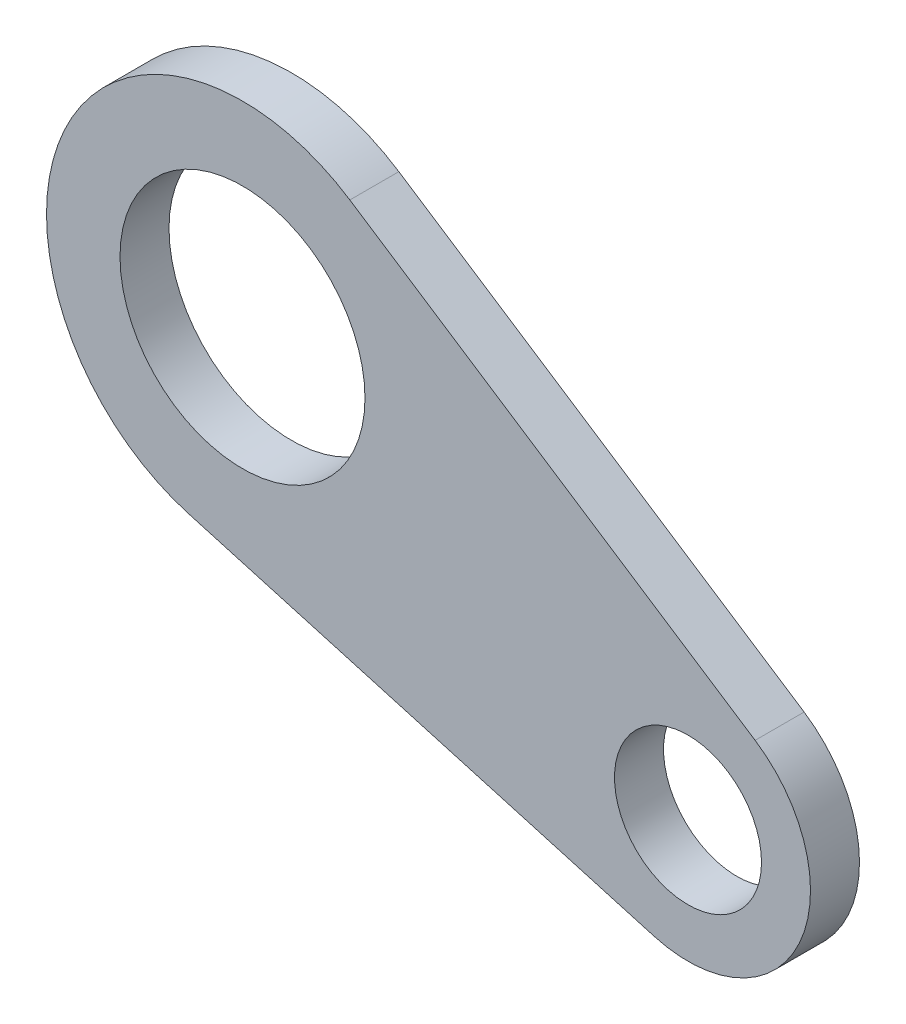
ISO-10303-21;
HEADER;
FILE_DESCRIPTION(('STEP AP214'),'2;1');
FILE_NAME('part.step','',(''),(''),'','','');
FILE_SCHEMA(('AUTOMOTIVE_DESIGN { 1 0 10303 214 1 1 1 1 }'));
ENDSEC;
DATA;
#1=APPLICATION_CONTEXT('core data for automotive mechanical design processes');
#2=APPLICATION_PROTOCOL_DEFINITION('international standard','automotive_design',2000,#1);
#3=PRODUCT_CONTEXT('',#1,'mechanical');
#4=PRODUCT('Part','Part','',(#3));
#5=PRODUCT_RELATED_PRODUCT_CATEGORY('part','',(#4));
#6=PRODUCT_DEFINITION_FORMATION('','',#4);
#7=PRODUCT_DEFINITION_CONTEXT('part definition',#1,'design');
#8=PRODUCT_DEFINITION('design','',#6,#7);
#9=PRODUCT_DEFINITION_SHAPE('','',#8);
#10=(LENGTH_UNIT() NAMED_UNIT(*) SI_UNIT(.MILLI.,.METRE.));
#11=(NAMED_UNIT(*) PLANE_ANGLE_UNIT() SI_UNIT($,.RADIAN.));
#12=(NAMED_UNIT(*) SI_UNIT($,.STERADIAN.) SOLID_ANGLE_UNIT());
#13=UNCERTAINTY_MEASURE_WITH_UNIT(LENGTH_MEASURE(1.E-05),#10,'distance_accuracy_value','');
#14=(GEOMETRIC_REPRESENTATION_CONTEXT(3) GLOBAL_UNCERTAINTY_ASSIGNED_CONTEXT((#13)) GLOBAL_UNIT_ASSIGNED_CONTEXT((#10,
#11,#12)) REPRESENTATION_CONTEXT('',''));
#15=CARTESIAN_POINT('',(0.,0.,0.));
#16=DIRECTION('',(0.,0.,1.));
#17=DIRECTION('',(1.,0.,0.));
#18=AXIS2_PLACEMENT_3D('',#15,#16,#17);
#19=CARTESIAN_POINT('',(-104.570506238801,47.8540408425545,1.));
#20=DIRECTION('',(0.,0.,-1.));
#21=DIRECTION('',(-1.,0.,0.));
#22=AXIS2_PLACEMENT_3D('',#19,#20,#21);
#23=CYLINDRICAL_SURFACE('',#22,2.5);
#24=CARTESIAN_POINT('',(-104.570506238801,47.8540408425545,0.));
#25=DIRECTION('',(0.,0.,1.));
#26=DIRECTION('',(1.,0.,0.));
#27=AXIS2_PLACEMENT_3D('',#24,#25,#26);
#28=CIRCLE('',#27,2.5);
#29=CARTESIAN_POINT('',(-103.200980238787,49.9455471263809,0.));
#30=VERTEX_POINT('',#29);
#31=CARTESIAN_POINT('',(-105.258050676388,45.4504429880159,0.));
#32=VERTEX_POINT('',#31);
#33=EDGE_CURVE('E118',#30,#32,#28,.F.);
#34=ORIENTED_EDGE('',*,*,#33,.F.);
#35=DIRECTION('',(0.,0.,-1.));
#36=VECTOR('',#35,1.);
#37=CARTESIAN_POINT('',(-103.200980238787,49.9455471263809,1.));
#38=LINE('',#37,#36);
#39=CARTESIAN_POINT('',(-103.200980238787,49.9455471263809,1.));
#40=VERTEX_POINT('',#39);
#41=EDGE_CURVE('E11',#40,#30,#38,.T.);
#42=ORIENTED_EDGE('',*,*,#41,.F.);
#43=CARTESIAN_POINT('',(-104.570506238801,47.8540408425545,1.));
#44=DIRECTION('',(0.,0.,1.));
#45=DIRECTION('',(1.,0.,0.));
#46=AXIS2_PLACEMENT_3D('',#43,#44,#45);
#47=CIRCLE('',#46,2.5);
#48=CARTESIAN_POINT('',(-105.258050676388,45.4504429880159,1.));
#49=VERTEX_POINT('',#48);
#50=EDGE_CURVE('E99',#40,#49,#47,.F.);
#51=ORIENTED_EDGE('',*,*,#50,.T.);
#52=DIRECTION('',(0.,0.,-1.));
#53=VECTOR('',#52,1.);
#54=CARTESIAN_POINT('',(-105.258050676388,45.4504429880159,1.));
#55=LINE('',#54,#53);
#56=EDGE_CURVE('E58',#49,#32,#55,.T.);
#57=ORIENTED_EDGE('',*,*,#56,.T.);
#58=EDGE_LOOP('',(#34,#42,#51,#57));
#59=FACE_BOUND('',#58,.T.);
#60=ADVANCED_FACE('F41',(#59),#23,.T.);
#61=CARTESIAN_POINT('',(-8.08020340008388,-12.3398870745755,1.));
#62=DIRECTION('',(0.547810400005682,0.836602513530538,0.));
#63=DIRECTION('',(-0.836602513530538,0.547810400005682,0.));
#64=AXIS2_PLACEMENT_3D('',#61,#62,#63);
#65=PLANE('',#64);
#66=DIRECTION('',(0.836602513530538,-0.547810400005682,0.));
#67=VECTOR('',#66,1.);
#68=CARTESIAN_POINT('',(-8.08020340008388,-12.3398870745755,0.));
#69=LINE('',#68,#67);
#70=CARTESIAN_POINT('',(-111.472352137804,55.3616718395075,0.));
#71=VERTEX_POINT('',#70);
#72=EDGE_CURVE('E88',#71,#30,#69,.T.);
#73=ORIENTED_EDGE('',*,*,#72,.F.);
#74=DIRECTION('',(0.,0.,-1.));
#75=VECTOR('',#74,1.);
#76=CARTESIAN_POINT('',(-111.472352137804,55.3616718395075,1.));
#77=LINE('',#76,#75);
#78=CARTESIAN_POINT('',(-111.472352137804,55.3616718395075,1.));
#79=VERTEX_POINT('',#78);
#80=EDGE_CURVE('E50',#79,#71,#77,.T.);
#81=ORIENTED_EDGE('',*,*,#80,.F.);
#82=DIRECTION('',(0.836602513530538,-0.547810400005682,0.));
#83=VECTOR('',#82,1.);
#84=CARTESIAN_POINT('',(-8.08020340008388,-12.3398870745755,1.));
#85=LINE('',#84,#83);
#86=EDGE_CURVE('E86',#79,#40,#85,.T.);
#87=ORIENTED_EDGE('',*,*,#86,.T.);
#88=ORIENTED_EDGE('',*,*,#41,.T.);
#89=EDGE_LOOP('',(#73,#81,#87,#88));
#90=FACE_BOUND('',#89,.T.);
#91=ADVANCED_FACE('F85',(#90),#65,.T.);
#92=CARTESIAN_POINT('',(-113.663593737827,52.0152617853854,1.));
#93=DIRECTION('',(0.,0.,-1.));
#94=DIRECTION('',(-1.,0.,0.));
#95=AXIS2_PLACEMENT_3D('',#92,#93,#94);
#96=CYLINDRICAL_SURFACE('',#95,4.00000000000001);
#97=CARTESIAN_POINT('',(-113.663593737827,52.0152617853854,0.));
#98=DIRECTION('',(0.,0.,1.));
#99=DIRECTION('',(1.,0.,0.));
#100=AXIS2_PLACEMENT_3D('',#97,#98,#99);
#101=CIRCLE('',#100,4.00000000000001);
#102=CARTESIAN_POINT('',(-114.763664837967,48.1695052181235,0.));
#103=VERTEX_POINT('',#102);
#104=EDGE_CURVE('E123',#103,#71,#101,.F.);
#105=ORIENTED_EDGE('',*,*,#104,.F.);
#106=DIRECTION('',(0.,0.,-1.));
#107=VECTOR('',#106,1.);
#108=CARTESIAN_POINT('',(-114.763664837967,48.1695052181235,1.));
#109=LINE('',#108,#107);
#110=CARTESIAN_POINT('',(-114.763664837967,48.1695052181235,1.));
#111=VERTEX_POINT('',#110);
#112=EDGE_CURVE('E71',#111,#103,#109,.T.);
#113=ORIENTED_EDGE('',*,*,#112,.F.);
#114=CARTESIAN_POINT('',(-113.663593737827,52.0152617853854,1.));
#115=DIRECTION('',(0.,0.,1.));
#116=DIRECTION('',(1.,0.,0.));
#117=AXIS2_PLACEMENT_3D('',#114,#115,#116);
#118=CIRCLE('',#117,4.00000000000001);
#119=EDGE_CURVE('E98',#111,#79,#118,.F.);
#120=ORIENTED_EDGE('',*,*,#119,.T.);
#121=ORIENTED_EDGE('',*,*,#80,.T.);
#122=EDGE_LOOP('',(#105,#113,#120,#121));
#123=FACE_BOUND('',#122,.T.);
#124=ADVANCED_FACE('F102',(#123),#96,.T.);
#125=CARTESIAN_POINT('',(-113.663593737827,52.0152617853854,1.));
#126=DIRECTION('',(0.,0.,-1.));
#127=DIRECTION('',(-1.,0.,0.));
#128=AXIS2_PLACEMENT_3D('',#125,#126,#127);
#129=CYLINDRICAL_SURFACE('',#128,2.5);
#130=CARTESIAN_POINT('',(-113.663593737827,52.0152617853854,1.));
#131=DIRECTION('',(0.,0.,1.));
#132=DIRECTION('',(1.,0.,0.));
#133=AXIS2_PLACEMENT_3D('',#130,#131,#132);
#134=CIRCLE('',#133,2.5);
#135=CARTESIAN_POINT('',(-111.163593737827,52.0152617853854,1.));
#136=VERTEX_POINT('',#135);
#137=EDGE_CURVE('E107',#136,#136,#134,.T.);
#138=ORIENTED_EDGE('',*,*,#137,.T.);
#139=EDGE_LOOP('',(#138));
#140=FACE_BOUND('',#139,.T.);
#141=CARTESIAN_POINT('',(-113.663593737827,52.0152617853854,0.));
#142=DIRECTION('',(0.,0.,1.));
#143=DIRECTION('',(1.,0.,0.));
#144=AXIS2_PLACEMENT_3D('',#141,#142,#143);
#145=CIRCLE('',#144,2.5);
#146=CARTESIAN_POINT('',(-111.163593737827,52.0152617853854,0.));
#147=VERTEX_POINT('',#146);
#148=EDGE_CURVE('E130',#147,#147,#145,.T.);
#149=ORIENTED_EDGE('',*,*,#148,.F.);
#150=EDGE_LOOP('',(#149));
#151=FACE_BOUND('',#150,.T.);
#152=ADVANCED_FACE('F147',(#140,#151),#129,.F.);
#153=CARTESIAN_POINT('',(4.05651218176472,14.1812273417781,1.));
#154=DIRECTION('',(-0.275017775034896,-0.961439141815464,0.));
#155=DIRECTION('',(0.961439141815464,-0.275017775034896,0.));
#156=AXIS2_PLACEMENT_3D('',#153,#154,#155);
#157=PLANE('',#156);
#158=DIRECTION('',(-0.961439141815464,0.275017775034896,0.));
#159=VECTOR('',#158,1.);
#160=CARTESIAN_POINT('',(4.05651218176472,14.1812273417781,0.));
#161=LINE('',#160,#159);
#162=EDGE_CURVE('E126',#32,#103,#161,.T.);
#163=ORIENTED_EDGE('',*,*,#162,.F.);
#164=ORIENTED_EDGE('',*,*,#56,.F.);
#165=DIRECTION('',(-0.961439141815464,0.275017775034896,0.));
#166=VECTOR('',#165,1.);
#167=CARTESIAN_POINT('',(4.05651218176472,14.1812273417781,1.));
#168=LINE('',#167,#166);
#169=EDGE_CURVE('E104',#49,#111,#168,.T.);
#170=ORIENTED_EDGE('',*,*,#169,.T.);
#171=ORIENTED_EDGE('',*,*,#112,.T.);
#172=EDGE_LOOP('',(#163,#164,#170,#171));
#173=FACE_BOUND('',#172,.T.);
#174=ADVANCED_FACE('F144',(#173),#157,.T.);
#175=CARTESIAN_POINT('',(-104.570506238801,47.8540408425545,1.));
#176=DIRECTION('',(0.,0.,-1.));
#177=DIRECTION('',(-1.,0.,0.));
#178=AXIS2_PLACEMENT_3D('',#175,#176,#177);
#179=CYLINDRICAL_SURFACE('',#178,1.5);
#180=CARTESIAN_POINT('',(-104.570506238801,47.8540408425545,1.));
#181=DIRECTION('',(0.,0.,1.));
#182=DIRECTION('',(1.,0.,0.));
#183=AXIS2_PLACEMENT_3D('',#180,#181,#182);
#184=CIRCLE('',#183,1.5);
#185=CARTESIAN_POINT('',(-103.070506238801,47.8540408425545,1.));
#186=VERTEX_POINT('',#185);
#187=EDGE_CURVE('E114',#186,#186,#184,.T.);
#188=ORIENTED_EDGE('',*,*,#187,.T.);
#189=EDGE_LOOP('',(#188));
#190=FACE_BOUND('',#189,.T.);
#191=CARTESIAN_POINT('',(-104.570506238801,47.8540408425545,0.));
#192=DIRECTION('',(0.,0.,1.));
#193=DIRECTION('',(1.,0.,0.));
#194=AXIS2_PLACEMENT_3D('',#191,#192,#193);
#195=CIRCLE('',#194,1.5);
#196=CARTESIAN_POINT('',(-103.070506238801,47.8540408425545,0.));
#197=VERTEX_POINT('',#196);
#198=EDGE_CURVE('E134',#197,#197,#195,.T.);
#199=ORIENTED_EDGE('',*,*,#198,.F.);
#200=EDGE_LOOP('',(#199));
#201=FACE_BOUND('',#200,.T.);
#202=ADVANCED_FACE('F146',(#190,#201),#179,.F.);
#203=CARTESIAN_POINT('',(0.,0.,1.));
#204=DIRECTION('',(0.,0.,1.));
#205=DIRECTION('',(1.,0.,0.));
#206=AXIS2_PLACEMENT_3D('',#203,#204,#205);
#207=PLANE('',#206);
#208=ORIENTED_EDGE('',*,*,#50,.F.);
#209=ORIENTED_EDGE('',*,*,#86,.F.);
#210=ORIENTED_EDGE('',*,*,#119,.F.);
#211=ORIENTED_EDGE('',*,*,#169,.F.);
#212=EDGE_LOOP('',(#208,#209,#210,#211));
#213=FACE_BOUND('',#212,.T.);
#214=ORIENTED_EDGE('',*,*,#137,.F.);
#215=EDGE_LOOP('',(#214));
#216=FACE_BOUND('',#215,.T.);
#217=ORIENTED_EDGE('',*,*,#187,.F.);
#218=EDGE_LOOP('',(#217));
#219=FACE_BOUND('',#218,.T.);
#220=ADVANCED_FACE('F95',(#213,#216,#219),#207,.T.);
#221=CARTESIAN_POINT('',(0.,0.,0.));
#222=DIRECTION('',(0.,0.,1.));
#223=DIRECTION('',(1.,0.,0.));
#224=AXIS2_PLACEMENT_3D('',#221,#222,#223);
#225=PLANE('',#224);
#226=ORIENTED_EDGE('',*,*,#33,.T.);
#227=ORIENTED_EDGE('',*,*,#162,.T.);
#228=ORIENTED_EDGE('',*,*,#104,.T.);
#229=ORIENTED_EDGE('',*,*,#72,.T.);
#230=EDGE_LOOP('',(#226,#227,#228,#229));
#231=FACE_BOUND('',#230,.T.);
#232=ORIENTED_EDGE('',*,*,#148,.T.);
#233=EDGE_LOOP('',(#232));
#234=FACE_BOUND('',#233,.T.);
#235=ORIENTED_EDGE('',*,*,#198,.T.);
#236=EDGE_LOOP('',(#235));
#237=FACE_BOUND('',#236,.T.);
#238=ADVANCED_FACE('F190',(#231,#234,#237),#225,.F.);
#239=CLOSED_SHELL('',(#60,#91,#124,#152,#174,#202,#220,#238));
#240=MANIFOLD_SOLID_BREP('B2',#239);
#241=ADVANCED_BREP_SHAPE_REPRESENTATION('',(#18,#240),#14);
#242=SHAPE_DEFINITION_REPRESENTATION(#9,#241);
ENDSEC;
END-ISO-10303-21;
